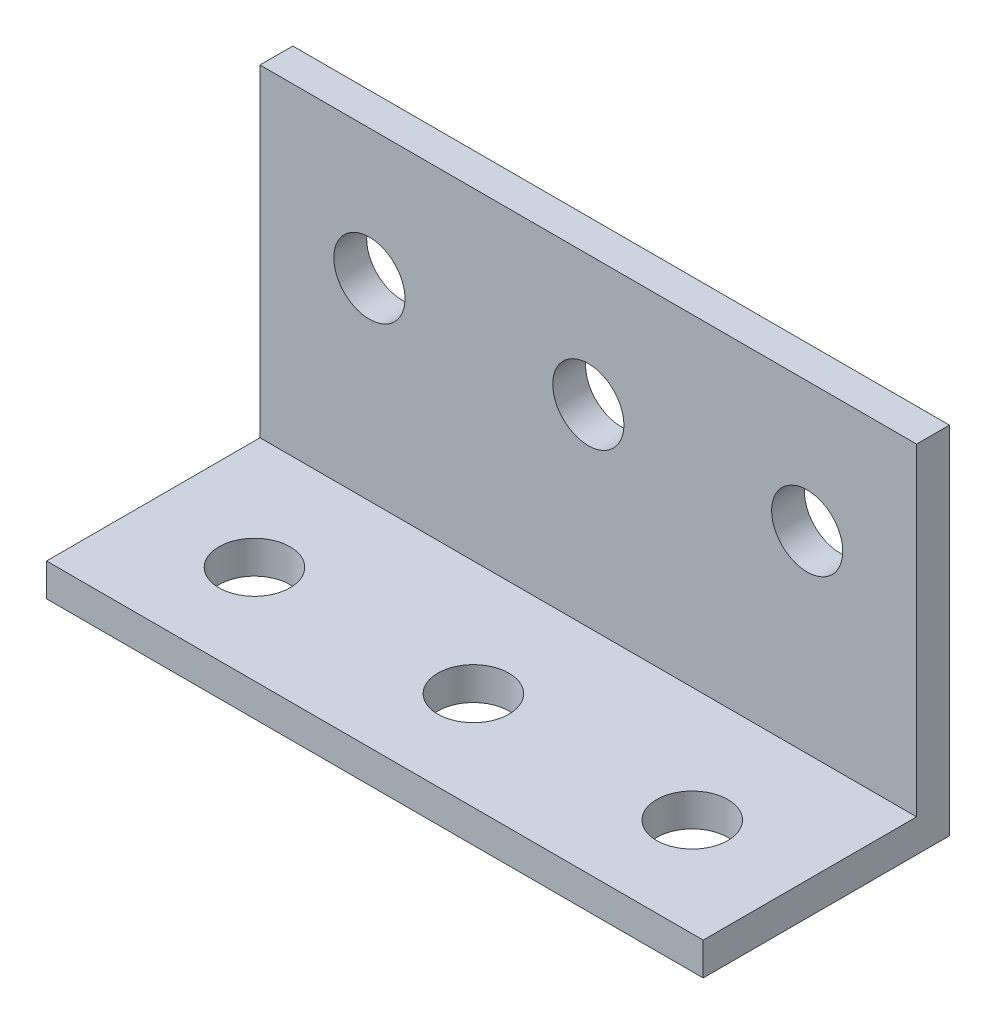
ISO-10303-21;
HEADER;
FILE_DESCRIPTION(('STEP AP214'),'2;1');
FILE_NAME('part.step','',(''),(''),'','','');
FILE_SCHEMA(('AUTOMOTIVE_DESIGN { 1 0 10303 214 1 1 1 1 }'));
ENDSEC;
DATA;
#1=APPLICATION_CONTEXT('core data for automotive mechanical design processes');
#2=APPLICATION_PROTOCOL_DEFINITION('international standard','automotive_design',2000,#1);
#3=PRODUCT_CONTEXT('',#1,'mechanical');
#4=PRODUCT('Part','Part','',(#3));
#5=PRODUCT_RELATED_PRODUCT_CATEGORY('part','',(#4));
#6=PRODUCT_DEFINITION_FORMATION('','',#4);
#7=PRODUCT_DEFINITION_CONTEXT('part definition',#1,'design');
#8=PRODUCT_DEFINITION('design','',#6,#7);
#9=PRODUCT_DEFINITION_SHAPE('','',#8);
#10=(LENGTH_UNIT() NAMED_UNIT(*) SI_UNIT(.MILLI.,.METRE.));
#11=(NAMED_UNIT(*) PLANE_ANGLE_UNIT() SI_UNIT($,.RADIAN.));
#12=(NAMED_UNIT(*) SI_UNIT($,.STERADIAN.) SOLID_ANGLE_UNIT());
#13=UNCERTAINTY_MEASURE_WITH_UNIT(LENGTH_MEASURE(1.E-05),#10,'distance_accuracy_value','');
#14=(GEOMETRIC_REPRESENTATION_CONTEXT(3) GLOBAL_UNCERTAINTY_ASSIGNED_CONTEXT((#13)) GLOBAL_UNIT_ASSIGNED_CONTEXT((#10,
#11,#12)) REPRESENTATION_CONTEXT('',''));
#15=CARTESIAN_POINT('',(0.,0.,0.));
#16=DIRECTION('',(0.,0.,1.));
#17=DIRECTION('',(1.,0.,0.));
#18=AXIS2_PLACEMENT_3D('',#15,#16,#17);
#19=CARTESIAN_POINT('',(0.,0.,90.));
#20=DIRECTION('',(1.,0.,0.));
#21=DIRECTION('',(0.,1.,0.));
#22=AXIS2_PLACEMENT_3D('',#19,#20,#21);
#23=PLANE('',#22);
#24=DIRECTION('',(0.,-1.,0.));
#25=VECTOR('',#24,1.);
#26=CARTESIAN_POINT('',(0.,0.,90.));
#27=LINE('',#26,#25);
#28=CARTESIAN_POINT('',(0.,12.,90.));
#29=VERTEX_POINT('',#28);
#30=CARTESIAN_POINT('',(0.,0.,90.));
#31=VERTEX_POINT('',#30);
#32=EDGE_CURVE('E99',#29,#31,#27,.T.);
#33=ORIENTED_EDGE('',*,*,#32,.F.);
#34=DIRECTION('',(0.,0.,1.));
#35=VECTOR('',#34,1.);
#36=CARTESIAN_POINT('',(0.,12.,90.));
#37=LINE('',#36,#35);
#38=CARTESIAN_POINT('',(0.,12.,12.));
#39=VERTEX_POINT('',#38);
#40=EDGE_CURVE('E49',#39,#29,#37,.T.);
#41=ORIENTED_EDGE('',*,*,#40,.F.);
#42=DIRECTION('',(0.,-1.,0.));
#43=VECTOR('',#42,1.);
#44=CARTESIAN_POINT('',(0.,130.,12.));
#45=LINE('',#44,#43);
#46=CARTESIAN_POINT('',(0.,130.,12.));
#47=VERTEX_POINT('',#46);
#48=EDGE_CURVE('E86',#47,#39,#45,.T.);
#49=ORIENTED_EDGE('',*,*,#48,.F.);
#50=DIRECTION('',(0.,0.,-1.));
#51=VECTOR('',#50,1.);
#52=CARTESIAN_POINT('',(0.,130.,90.));
#53=LINE('',#52,#51);
#54=CARTESIAN_POINT('',(0.,130.,0.));
#55=VERTEX_POINT('',#54);
#56=EDGE_CURVE('E78',#47,#55,#53,.T.);
#57=ORIENTED_EDGE('',*,*,#56,.T.);
#58=DIRECTION('',(0.,-1.,0.));
#59=VECTOR('',#58,1.);
#60=CARTESIAN_POINT('',(0.,0.,0.));
#61=LINE('',#60,#59);
#62=CARTESIAN_POINT('',(0.,0.,0.));
#63=VERTEX_POINT('',#62);
#64=EDGE_CURVE('E83',#55,#63,#61,.T.);
#65=ORIENTED_EDGE('',*,*,#64,.T.);
#66=DIRECTION('',(0.,0.,-1.));
#67=VECTOR('',#66,1.);
#68=CARTESIAN_POINT('',(0.,0.,90.));
#69=LINE('',#68,#67);
#70=EDGE_CURVE('E119',#31,#63,#69,.T.);
#71=ORIENTED_EDGE('',*,*,#70,.F.);
#72=EDGE_LOOP('',(#33,#41,#49,#57,#65,#71));
#73=FACE_BOUND('',#72,.T.);
#74=ADVANCED_FACE('F34',(#73),#23,.F.);
#75=CARTESIAN_POINT('',(0.,0.,90.));
#76=DIRECTION('',(0.,1.,0.));
#77=DIRECTION('',(0.,0.,1.));
#78=AXIS2_PLACEMENT_3D('',#75,#76,#77);
#79=PLANE('',#78);
#80=CARTESIAN_POINT('',(120.,0.,54.));
#81=DIRECTION('',(0.,-1.,0.));
#82=DIRECTION('',(0.,0.,-1.));
#83=AXIS2_PLACEMENT_3D('',#80,#81,#82);
#84=CIRCLE('',#83,13.);
#85=CARTESIAN_POINT('',(120.,0.,41.));
#86=VERTEX_POINT('',#85);
#87=EDGE_CURVE('E262',#86,#86,#84,.T.);
#88=ORIENTED_EDGE('',*,*,#87,.F.);
#89=EDGE_LOOP('',(#88));
#90=FACE_BOUND('',#89,.T.);
#91=CARTESIAN_POINT('',(40.,0.,54.));
#92=DIRECTION('',(0.,-1.,0.));
#93=DIRECTION('',(0.,0.,-1.));
#94=AXIS2_PLACEMENT_3D('',#91,#92,#93);
#95=CIRCLE('',#94,13.);
#96=CARTESIAN_POINT('',(40.,0.,41.));
#97=VERTEX_POINT('',#96);
#98=EDGE_CURVE('E134',#97,#97,#95,.T.);
#99=ORIENTED_EDGE('',*,*,#98,.F.);
#100=EDGE_LOOP('',(#99));
#101=FACE_BOUND('',#100,.T.);
#102=DIRECTION('',(1.,0.,0.));
#103=VECTOR('',#102,1.);
#104=CARTESIAN_POINT('',(0.,0.,0.));
#105=LINE('',#104,#103);
#106=CARTESIAN_POINT('',(240.,0.,0.));
#107=VERTEX_POINT('',#106);
#108=EDGE_CURVE('E104',#63,#107,#105,.T.);
#109=ORIENTED_EDGE('',*,*,#108,.T.);
#110=DIRECTION('',(0.,0.,-1.));
#111=VECTOR('',#110,1.);
#112=CARTESIAN_POINT('',(240.,0.,90.));
#113=LINE('',#112,#111);
#114=CARTESIAN_POINT('',(240.,0.,90.));
#115=VERTEX_POINT('',#114);
#116=EDGE_CURVE('E116',#115,#107,#113,.T.);
#117=ORIENTED_EDGE('',*,*,#116,.F.);
#118=DIRECTION('',(1.,0.,0.));
#119=VECTOR('',#118,1.);
#120=CARTESIAN_POINT('',(0.,0.,90.));
#121=LINE('',#120,#119);
#122=EDGE_CURVE('E58',#31,#115,#121,.T.);
#123=ORIENTED_EDGE('',*,*,#122,.F.);
#124=ORIENTED_EDGE('',*,*,#70,.T.);
#125=EDGE_LOOP('',(#109,#117,#123,#124));
#126=FACE_BOUND('',#125,.T.);
#127=CARTESIAN_POINT('',(200.,0.,54.));
#128=DIRECTION('',(0.,-1.,0.));
#129=DIRECTION('',(0.,0.,-1.));
#130=AXIS2_PLACEMENT_3D('',#127,#128,#129);
#131=CIRCLE('',#130,13.);
#132=CARTESIAN_POINT('',(200.,0.,41.));
#133=VERTEX_POINT('',#132);
#134=EDGE_CURVE('E42',#133,#133,#131,.T.);
#135=ORIENTED_EDGE('',*,*,#134,.F.);
#136=EDGE_LOOP('',(#135));
#137=FACE_BOUND('',#136,.T.);
#138=ADVANCED_FACE('F140',(#90,#101,#126,#137),#79,.F.);
#139=CARTESIAN_POINT('',(240.,0.,90.));
#140=DIRECTION('',(-1.,0.,0.));
#141=DIRECTION('',(0.,-1.,0.));
#142=AXIS2_PLACEMENT_3D('',#139,#140,#141);
#143=PLANE('',#142);
#144=DIRECTION('',(0.,-1.,0.));
#145=VECTOR('',#144,1.);
#146=CARTESIAN_POINT('',(240.,130.,12.));
#147=LINE('',#146,#145);
#148=CARTESIAN_POINT('',(240.,130.,12.));
#149=VERTEX_POINT('',#148);
#150=CARTESIAN_POINT('',(240.,12.0000000000001,12.));
#151=VERTEX_POINT('',#150);
#152=EDGE_CURVE('E277',#149,#151,#147,.T.);
#153=ORIENTED_EDGE('',*,*,#152,.T.);
#154=DIRECTION('',(0.,0.,1.));
#155=VECTOR('',#154,1.);
#156=CARTESIAN_POINT('',(240.,12.0000000000001,90.));
#157=LINE('',#156,#155);
#158=CARTESIAN_POINT('',(240.,12.0000000000001,90.));
#159=VERTEX_POINT('',#158);
#160=EDGE_CURVE('E280',#151,#159,#157,.T.);
#161=ORIENTED_EDGE('',*,*,#160,.T.);
#162=DIRECTION('',(0.,1.,0.));
#163=VECTOR('',#162,1.);
#164=CARTESIAN_POINT('',(240.,0.,90.));
#165=LINE('',#164,#163);
#166=EDGE_CURVE('E90',#115,#159,#165,.T.);
#167=ORIENTED_EDGE('',*,*,#166,.F.);
#168=ORIENTED_EDGE('',*,*,#116,.T.);
#169=DIRECTION('',(0.,1.,0.));
#170=VECTOR('',#169,1.);
#171=CARTESIAN_POINT('',(240.,0.,0.));
#172=LINE('',#171,#170);
#173=CARTESIAN_POINT('',(240.,130.,0.));
#174=VERTEX_POINT('',#173);
#175=EDGE_CURVE('E100',#107,#174,#172,.T.);
#176=ORIENTED_EDGE('',*,*,#175,.T.);
#177=DIRECTION('',(0.,0.,-1.));
#178=VECTOR('',#177,1.);
#179=CARTESIAN_POINT('',(240.,130.,90.));
#180=LINE('',#179,#178);
#181=EDGE_CURVE('E89',#149,#174,#180,.T.);
#182=ORIENTED_EDGE('',*,*,#181,.F.);
#183=EDGE_LOOP('',(#153,#161,#167,#168,#176,#182));
#184=FACE_BOUND('',#183,.T.);
#185=ADVANCED_FACE('F142',(#184),#143,.F.);
#186=CARTESIAN_POINT('',(0.,130.,90.));
#187=DIRECTION('',(0.,-1.,0.));
#188=DIRECTION('',(0.,0.,-1.));
#189=AXIS2_PLACEMENT_3D('',#186,#187,#188);
#190=PLANE('',#189);
#191=ORIENTED_EDGE('',*,*,#56,.F.);
#192=DIRECTION('',(-1.,0.,0.));
#193=VECTOR('',#192,1.);
#194=CARTESIAN_POINT('',(240.,130.,12.));
#195=LINE('',#194,#193);
#196=EDGE_CURVE('E283',#149,#47,#195,.T.);
#197=ORIENTED_EDGE('',*,*,#196,.F.);
#198=ORIENTED_EDGE('',*,*,#181,.T.);
#199=DIRECTION('',(-1.,0.,0.));
#200=VECTOR('',#199,1.);
#201=CARTESIAN_POINT('',(0.,130.,0.));
#202=LINE('',#201,#200);
#203=EDGE_CURVE('E93',#174,#55,#202,.T.);
#204=ORIENTED_EDGE('',*,*,#203,.T.);
#205=EDGE_LOOP('',(#191,#197,#198,#204));
#206=FACE_BOUND('',#205,.T.);
#207=ADVANCED_FACE('F94',(#206),#190,.F.);
#208=CARTESIAN_POINT('',(0.,0.,90.));
#209=DIRECTION('',(0.,0.,-1.));
#210=DIRECTION('',(-1.,0.,0.));
#211=AXIS2_PLACEMENT_3D('',#208,#209,#210);
#212=PLANE('',#211);
#213=ORIENTED_EDGE('',*,*,#166,.T.);
#214=DIRECTION('',(-1.,0.,0.));
#215=VECTOR('',#214,1.);
#216=CARTESIAN_POINT('',(240.,12.0000000000001,90.));
#217=LINE('',#216,#215);
#218=EDGE_CURVE('E106',#159,#29,#217,.T.);
#219=ORIENTED_EDGE('',*,*,#218,.T.);
#220=ORIENTED_EDGE('',*,*,#32,.T.);
#221=ORIENTED_EDGE('',*,*,#122,.T.);
#222=EDGE_LOOP('',(#213,#219,#220,#221));
#223=FACE_BOUND('',#222,.T.);
#224=ADVANCED_FACE('F190',(#223),#212,.F.);
#225=CARTESIAN_POINT('',(0.,0.,0.));
#226=DIRECTION('',(0.,0.,-1.));
#227=DIRECTION('',(-1.,0.,0.));
#228=AXIS2_PLACEMENT_3D('',#225,#226,#227);
#229=PLANE('',#228);
#230=CARTESIAN_POINT('',(120.,82.5,0.));
#231=DIRECTION('',(0.,0.,-1.));
#232=DIRECTION('',(-1.,0.,0.));
#233=AXIS2_PLACEMENT_3D('',#230,#231,#232);
#234=CIRCLE('',#233,13.);
#235=CARTESIAN_POINT('',(107.,82.5,0.));
#236=VERTEX_POINT('',#235);
#237=EDGE_CURVE('E133',#236,#236,#234,.T.);
#238=ORIENTED_EDGE('',*,*,#237,.F.);
#239=EDGE_LOOP('',(#238));
#240=FACE_BOUND('',#239,.T.);
#241=CARTESIAN_POINT('',(200.,82.5,0.));
#242=DIRECTION('',(0.,0.,-1.));
#243=DIRECTION('',(-1.,0.,0.));
#244=AXIS2_PLACEMENT_3D('',#241,#242,#243);
#245=CIRCLE('',#244,13.);
#246=CARTESIAN_POINT('',(187.,82.5,0.));
#247=VERTEX_POINT('',#246);
#248=EDGE_CURVE('E125',#247,#247,#245,.T.);
#249=ORIENTED_EDGE('',*,*,#248,.F.);
#250=EDGE_LOOP('',(#249));
#251=FACE_BOUND('',#250,.T.);
#252=ORIENTED_EDGE('',*,*,#64,.F.);
#253=ORIENTED_EDGE('',*,*,#203,.F.);
#254=ORIENTED_EDGE('',*,*,#175,.F.);
#255=ORIENTED_EDGE('',*,*,#108,.F.);
#256=EDGE_LOOP('',(#252,#253,#254,#255));
#257=FACE_BOUND('',#256,.T.);
#258=CARTESIAN_POINT('',(40.,82.5,0.));
#259=DIRECTION('',(0.,0.,-1.));
#260=DIRECTION('',(-1.,0.,0.));
#261=AXIS2_PLACEMENT_3D('',#258,#259,#260);
#262=CIRCLE('',#261,13.);
#263=CARTESIAN_POINT('',(27.,82.5,0.));
#264=VERTEX_POINT('',#263);
#265=EDGE_CURVE('E121',#264,#264,#262,.T.);
#266=ORIENTED_EDGE('',*,*,#265,.F.);
#267=EDGE_LOOP('',(#266));
#268=FACE_BOUND('',#267,.T.);
#269=ADVANCED_FACE('F102',(#240,#251,#257,#268),#229,.T.);
#270=CARTESIAN_POINT('',(240.,12.0000000000001,90.));
#271=DIRECTION('',(0.,-1.,0.));
#272=DIRECTION('',(1.,0.,0.));
#273=AXIS2_PLACEMENT_3D('',#270,#271,#272);
#274=PLANE('',#273);
#275=CARTESIAN_POINT('',(120.,12.,54.));
#276=DIRECTION('',(0.,-1.,0.));
#277=DIRECTION('',(1.,0.,0.));
#278=AXIS2_PLACEMENT_3D('',#275,#276,#277);
#279=CIRCLE('',#278,13.);
#280=CARTESIAN_POINT('',(133.,12.,54.));
#281=VERTEX_POINT('',#280);
#282=EDGE_CURVE('E265',#281,#281,#279,.T.);
#283=ORIENTED_EDGE('',*,*,#282,.T.);
#284=EDGE_LOOP('',(#283));
#285=FACE_BOUND('',#284,.T.);
#286=CARTESIAN_POINT('',(40.,12.,54.));
#287=DIRECTION('',(0.,-1.,0.));
#288=DIRECTION('',(1.,0.,0.));
#289=AXIS2_PLACEMENT_3D('',#286,#287,#288);
#290=CIRCLE('',#289,13.);
#291=CARTESIAN_POINT('',(53.,12.,54.));
#292=VERTEX_POINT('',#291);
#293=EDGE_CURVE('E131',#292,#292,#290,.T.);
#294=ORIENTED_EDGE('',*,*,#293,.T.);
#295=EDGE_LOOP('',(#294));
#296=FACE_BOUND('',#295,.T.);
#297=ORIENTED_EDGE('',*,*,#40,.T.);
#298=ORIENTED_EDGE('',*,*,#218,.F.);
#299=ORIENTED_EDGE('',*,*,#160,.F.);
#300=DIRECTION('',(-1.,0.,0.));
#301=VECTOR('',#300,1.);
#302=CARTESIAN_POINT('',(240.,12.0000000000001,12.));
#303=LINE('',#302,#301);
#304=EDGE_CURVE('E109',#151,#39,#303,.T.);
#305=ORIENTED_EDGE('',*,*,#304,.T.);
#306=EDGE_LOOP('',(#297,#298,#299,#305));
#307=FACE_BOUND('',#306,.T.);
#308=CARTESIAN_POINT('',(200.,12.,54.));
#309=DIRECTION('',(0.,-1.,0.));
#310=DIRECTION('',(1.,0.,0.));
#311=AXIS2_PLACEMENT_3D('',#308,#309,#310);
#312=CIRCLE('',#311,13.);
#313=CARTESIAN_POINT('',(213.,12.,54.));
#314=VERTEX_POINT('',#313);
#315=EDGE_CURVE('E11',#314,#314,#312,.T.);
#316=ORIENTED_EDGE('',*,*,#315,.T.);
#317=EDGE_LOOP('',(#316));
#318=FACE_BOUND('',#317,.T.);
#319=ADVANCED_FACE('F176',(#285,#296,#307,#318),#274,.F.);
#320=CARTESIAN_POINT('',(240.,130.,12.));
#321=DIRECTION('',(0.,0.,-1.));
#322=DIRECTION('',(0.,1.,0.));
#323=AXIS2_PLACEMENT_3D('',#320,#321,#322);
#324=PLANE('',#323);
#325=CARTESIAN_POINT('',(120.,82.5,12.));
#326=DIRECTION('',(0.,0.,-1.));
#327=DIRECTION('',(0.,1.,0.));
#328=AXIS2_PLACEMENT_3D('',#325,#326,#327);
#329=CIRCLE('',#328,13.);
#330=CARTESIAN_POINT('',(107.,82.5,12.));
#331=VERTEX_POINT('',#330);
#332=EDGE_CURVE('E273',#331,#331,#329,.T.);
#333=ORIENTED_EDGE('',*,*,#332,.T.);
#334=EDGE_LOOP('',(#333));
#335=FACE_BOUND('',#334,.T.);
#336=CARTESIAN_POINT('',(200.,82.5,12.));
#337=DIRECTION('',(0.,0.,-1.));
#338=DIRECTION('',(0.,1.,0.));
#339=AXIS2_PLACEMENT_3D('',#336,#337,#338);
#340=CIRCLE('',#339,13.);
#341=CARTESIAN_POINT('',(187.,82.5,12.));
#342=VERTEX_POINT('',#341);
#343=EDGE_CURVE('E122',#342,#342,#340,.T.);
#344=ORIENTED_EDGE('',*,*,#343,.T.);
#345=EDGE_LOOP('',(#344));
#346=FACE_BOUND('',#345,.T.);
#347=ORIENTED_EDGE('',*,*,#48,.T.);
#348=ORIENTED_EDGE('',*,*,#304,.F.);
#349=ORIENTED_EDGE('',*,*,#152,.F.);
#350=ORIENTED_EDGE('',*,*,#196,.T.);
#351=EDGE_LOOP('',(#347,#348,#349,#350));
#352=FACE_BOUND('',#351,.T.);
#353=CARTESIAN_POINT('',(40.,82.5,12.));
#354=DIRECTION('',(0.,0.,-1.));
#355=DIRECTION('',(0.,1.,0.));
#356=AXIS2_PLACEMENT_3D('',#353,#354,#355);
#357=CIRCLE('',#356,13.);
#358=CARTESIAN_POINT('',(27.,82.5,12.));
#359=VERTEX_POINT('',#358);
#360=EDGE_CURVE('E128',#359,#359,#357,.T.);
#361=ORIENTED_EDGE('',*,*,#360,.T.);
#362=EDGE_LOOP('',(#361));
#363=FACE_BOUND('',#362,.T.);
#364=ADVANCED_FACE('F174',(#335,#346,#352,#363),#324,.F.);
#365=CARTESIAN_POINT('',(200.,82.5,90.));
#366=DIRECTION('',(0.,0.,-1.));
#367=DIRECTION('',(-1.,0.,0.));
#368=AXIS2_PLACEMENT_3D('',#365,#366,#367);
#369=CYLINDRICAL_SURFACE('',#368,13.);
#370=CARTESIAN_POINT('',(187.,82.5,0.));
#371=CARTESIAN_POINT('',(187.,82.5,0.125));
#372=CARTESIAN_POINT('',(187.,82.5,0.25));
#373=CARTESIAN_POINT('',(187.,82.5,0.5));
#374=CARTESIAN_POINT('',(187.,82.5,0.625000000000001));
#375=CARTESIAN_POINT('',(187.,82.5,0.875000000000001));
#376=CARTESIAN_POINT('',(187.,82.5,1.));
#377=CARTESIAN_POINT('',(187.,82.5,1.25));
#378=CARTESIAN_POINT('',(187.,82.5,1.375));
#379=CARTESIAN_POINT('',(187.,82.5,1.625));
#380=CARTESIAN_POINT('',(187.,82.5,1.75));
#381=CARTESIAN_POINT('',(187.,82.5,2.));
#382=CARTESIAN_POINT('',(187.,82.5,2.125));
#383=CARTESIAN_POINT('',(187.,82.5,2.375));
#384=CARTESIAN_POINT('',(187.,82.5,2.5));
#385=CARTESIAN_POINT('',(187.,82.5,2.75));
#386=CARTESIAN_POINT('',(187.,82.5,2.875));
#387=CARTESIAN_POINT('',(187.,82.5,3.125));
#388=CARTESIAN_POINT('',(187.,82.5,3.24999999999999));
#389=CARTESIAN_POINT('',(187.,82.5,3.49999999999999));
#390=CARTESIAN_POINT('',(187.,82.5,3.62499999999999));
#391=CARTESIAN_POINT('',(187.,82.5,3.87499999999999));
#392=CARTESIAN_POINT('',(187.,82.5,3.99999999999999));
#393=CARTESIAN_POINT('',(187.,82.5,4.24999999999999));
#394=CARTESIAN_POINT('',(187.,82.5,4.37499999999999));
#395=CARTESIAN_POINT('',(187.,82.5,4.62499999999999));
#396=CARTESIAN_POINT('',(187.,82.5,4.74999999999999));
#397=CARTESIAN_POINT('',(187.,82.5,4.99999999999999));
#398=CARTESIAN_POINT('',(187.,82.5,5.12499999999999));
#399=CARTESIAN_POINT('',(187.,82.5,5.37499999999999));
#400=CARTESIAN_POINT('',(187.,82.5,5.49999999999999));
#401=CARTESIAN_POINT('',(187.,82.5,5.74999999999999));
#402=CARTESIAN_POINT('',(187.,82.5,5.87499999999999));
#403=CARTESIAN_POINT('',(187.,82.5,6.12499999999999));
#404=CARTESIAN_POINT('',(187.,82.5,6.24999999999999));
#405=CARTESIAN_POINT('',(187.,82.5,6.49999999999999));
#406=CARTESIAN_POINT('',(187.,82.5,6.62499999999999));
#407=CARTESIAN_POINT('',(187.,82.5,6.87499999999999));
#408=CARTESIAN_POINT('',(187.,82.5,6.99999999999999));
#409=CARTESIAN_POINT('',(187.,82.5,7.24999999999999));
#410=CARTESIAN_POINT('',(187.,82.5,7.37499999999999));
#411=CARTESIAN_POINT('',(187.,82.5,7.62499999999999));
#412=CARTESIAN_POINT('',(187.,82.5,7.74999999999999));
#413=CARTESIAN_POINT('',(187.,82.5,7.99999999999999));
#414=CARTESIAN_POINT('',(187.,82.5,8.12499999999999));
#415=CARTESIAN_POINT('',(187.,82.5,8.37499999999999));
#416=CARTESIAN_POINT('',(187.,82.5,8.49999999999999));
#417=CARTESIAN_POINT('',(187.,82.5,8.74999999999999));
#418=CARTESIAN_POINT('',(187.,82.5,8.87499999999999));
#419=CARTESIAN_POINT('',(187.,82.5,9.12499999999999));
#420=CARTESIAN_POINT('',(187.,82.5,9.24999999999999));
#421=CARTESIAN_POINT('',(187.,82.5,9.49999999999999));
#422=CARTESIAN_POINT('',(187.,82.5,9.62499999999999));
#423=CARTESIAN_POINT('',(187.,82.5,9.87499999999998));
#424=CARTESIAN_POINT('',(187.,82.5,9.99999999999998));
#425=CARTESIAN_POINT('',(187.,82.5,10.25));
#426=CARTESIAN_POINT('',(187.,82.5,10.375));
#427=CARTESIAN_POINT('',(187.,82.5,10.625));
#428=CARTESIAN_POINT('',(187.,82.5,10.75));
#429=CARTESIAN_POINT('',(187.,82.5,11.));
#430=CARTESIAN_POINT('',(187.,82.5,11.125));
#431=CARTESIAN_POINT('',(187.,82.5,11.375));
#432=CARTESIAN_POINT('',(187.,82.5,11.5));
#433=CARTESIAN_POINT('',(187.,82.5,11.75));
#434=CARTESIAN_POINT('',(187.,82.5,11.875));
#435=CARTESIAN_POINT('',(187.,82.5,12.));
#436=B_SPLINE_CURVE_WITH_KNOTS('',3,(#370,#371,#372,#373,#374,#375,#376,#377,#378,#379,#380,
#381,#382,#383,#384,#385,#386,#387,#388,#389,#390,#391,#392,#393,#394,#395,#396,#397,#398,#399,
#400,#401,#402,#403,#404,#405,#406,#407,#408,#409,#410,#411,#412,#413,#414,#415,#416,#417,#418,
#419,#420,#421,#422,#423,#424,#425,#426,#427,#428,#429,#430,#431,#432,#433,#434,#435),
.UNSPECIFIED.,.F.,.F.,(4,2,2,2,2,2,2,2,2,2,2,2,2,2,2,2,2,2,2,2,2,2,2,2,2,2,2,2,2,2,2,2,4),(0.,
0.375,0.750000000000001,1.125,1.5,1.875,2.25,2.625,3.,3.37499999999999,3.74999999999999,
4.12499999999999,4.49999999999999,4.87499999999999,5.24999999999999,5.62499999999999,
5.99999999999999,6.37499999999999,6.74999999999999,7.12499999999999,7.49999999999999,
7.87499999999999,8.24999999999999,8.62499999999999,8.99999999999998,9.37499999999999,
9.74999999999998,10.125,10.5,10.875,11.25,11.625,12.),.UNSPECIFIED.);
#437=EDGE_CURVE('BSEAM167',#247,#342,#436,.T.);
#438=ORIENTED_EDGE('',*,*,#248,.T.);
#439=ORIENTED_EDGE('',*,*,#343,.F.);
#440=ORIENTED_EDGE('',*,*,#437,.T.);
#441=ORIENTED_EDGE('',*,*,#437,.F.);
#442=EDGE_LOOP('',(#438,#440,#439,#441));
#443=FACE_BOUND('',#442,.T.);
#444=ADVANCED_FACE('F167',(#443),#369,.F.);
#445=CARTESIAN_POINT('',(120.,82.5,90.));
#446=DIRECTION('',(0.,0.,-1.));
#447=DIRECTION('',(-1.,0.,0.));
#448=AXIS2_PLACEMENT_3D('',#445,#446,#447);
#449=CYLINDRICAL_SURFACE('',#448,13.);
#450=CARTESIAN_POINT('',(107.,82.5,0.));
#451=CARTESIAN_POINT('',(107.,82.5,0.125));
#452=CARTESIAN_POINT('',(107.,82.5,0.25));
#453=CARTESIAN_POINT('',(107.,82.5,0.5));
#454=CARTESIAN_POINT('',(107.,82.5,0.625000000000001));
#455=CARTESIAN_POINT('',(107.,82.5,0.875000000000001));
#456=CARTESIAN_POINT('',(107.,82.5,1.));
#457=CARTESIAN_POINT('',(107.,82.5,1.25));
#458=CARTESIAN_POINT('',(107.,82.5,1.375));
#459=CARTESIAN_POINT('',(107.,82.5,1.625));
#460=CARTESIAN_POINT('',(107.,82.5,1.75));
#461=CARTESIAN_POINT('',(107.,82.5,2.));
#462=CARTESIAN_POINT('',(107.,82.5,2.125));
#463=CARTESIAN_POINT('',(107.,82.5,2.375));
#464=CARTESIAN_POINT('',(107.,82.5,2.5));
#465=CARTESIAN_POINT('',(107.,82.5,2.75));
#466=CARTESIAN_POINT('',(107.,82.5,2.875));
#467=CARTESIAN_POINT('',(107.,82.5,3.125));
#468=CARTESIAN_POINT('',(107.,82.5,3.24999999999999));
#469=CARTESIAN_POINT('',(107.,82.5,3.49999999999999));
#470=CARTESIAN_POINT('',(107.,82.5,3.62499999999999));
#471=CARTESIAN_POINT('',(107.,82.5,3.87499999999999));
#472=CARTESIAN_POINT('',(107.,82.5,3.99999999999999));
#473=CARTESIAN_POINT('',(107.,82.5,4.24999999999999));
#474=CARTESIAN_POINT('',(107.,82.5,4.37499999999999));
#475=CARTESIAN_POINT('',(107.,82.5,4.62499999999999));
#476=CARTESIAN_POINT('',(107.,82.5,4.74999999999999));
#477=CARTESIAN_POINT('',(107.,82.5,4.99999999999999));
#478=CARTESIAN_POINT('',(107.,82.5,5.12499999999999));
#479=CARTESIAN_POINT('',(107.,82.5,5.37499999999999));
#480=CARTESIAN_POINT('',(107.,82.5,5.49999999999999));
#481=CARTESIAN_POINT('',(107.,82.5,5.74999999999999));
#482=CARTESIAN_POINT('',(107.,82.5,5.87499999999999));
#483=CARTESIAN_POINT('',(107.,82.5,6.12499999999999));
#484=CARTESIAN_POINT('',(107.,82.5,6.24999999999999));
#485=CARTESIAN_POINT('',(107.,82.5,6.49999999999999));
#486=CARTESIAN_POINT('',(107.,82.5,6.62499999999999));
#487=CARTESIAN_POINT('',(107.,82.5,6.87499999999999));
#488=CARTESIAN_POINT('',(107.,82.5,6.99999999999999));
#489=CARTESIAN_POINT('',(107.,82.5,7.24999999999999));
#490=CARTESIAN_POINT('',(107.,82.5,7.37499999999999));
#491=CARTESIAN_POINT('',(107.,82.5,7.62499999999999));
#492=CARTESIAN_POINT('',(107.,82.5,7.74999999999999));
#493=CARTESIAN_POINT('',(107.,82.5,7.99999999999999));
#494=CARTESIAN_POINT('',(107.,82.5,8.12499999999999));
#495=CARTESIAN_POINT('',(107.,82.5,8.37499999999999));
#496=CARTESIAN_POINT('',(107.,82.5,8.49999999999999));
#497=CARTESIAN_POINT('',(107.,82.5,8.74999999999999));
#498=CARTESIAN_POINT('',(107.,82.5,8.87499999999999));
#499=CARTESIAN_POINT('',(107.,82.5,9.12499999999999));
#500=CARTESIAN_POINT('',(107.,82.5,9.24999999999999));
#501=CARTESIAN_POINT('',(107.,82.5,9.49999999999999));
#502=CARTESIAN_POINT('',(107.,82.5,9.62499999999999));
#503=CARTESIAN_POINT('',(107.,82.5,9.87499999999998));
#504=CARTESIAN_POINT('',(107.,82.5,9.99999999999998));
#505=CARTESIAN_POINT('',(107.,82.5,10.25));
#506=CARTESIAN_POINT('',(107.,82.5,10.375));
#507=CARTESIAN_POINT('',(107.,82.5,10.625));
#508=CARTESIAN_POINT('',(107.,82.5,10.75));
#509=CARTESIAN_POINT('',(107.,82.5,11.));
#510=CARTESIAN_POINT('',(107.,82.5,11.125));
#511=CARTESIAN_POINT('',(107.,82.5,11.375));
#512=CARTESIAN_POINT('',(107.,82.5,11.5));
#513=CARTESIAN_POINT('',(107.,82.5,11.75));
#514=CARTESIAN_POINT('',(107.,82.5,11.875));
#515=CARTESIAN_POINT('',(107.,82.5,12.));
#516=B_SPLINE_CURVE_WITH_KNOTS('',3,(#450,#451,#452,#453,#454,#455,#456,#457,#458,#459,#460,
#461,#462,#463,#464,#465,#466,#467,#468,#469,#470,#471,#472,#473,#474,#475,#476,#477,#478,#479,
#480,#481,#482,#483,#484,#485,#486,#487,#488,#489,#490,#491,#492,#493,#494,#495,#496,#497,#498,
#499,#500,#501,#502,#503,#504,#505,#506,#507,#508,#509,#510,#511,#512,#513,#514,#515),
.UNSPECIFIED.,.F.,.F.,(4,2,2,2,2,2,2,2,2,2,2,2,2,2,2,2,2,2,2,2,2,2,2,2,2,2,2,2,2,2,2,2,4),(0.,
0.375,0.750000000000001,1.125,1.5,1.875,2.25,2.625,3.,3.37499999999999,3.74999999999999,
4.12499999999999,4.49999999999999,4.87499999999999,5.24999999999999,5.62499999999999,
5.99999999999999,6.37499999999999,6.74999999999999,7.12499999999999,7.49999999999999,
7.87499999999999,8.24999999999999,8.62499999999999,8.99999999999998,9.37499999999999,
9.74999999999998,10.125,10.5,10.875,11.25,11.625,12.),.UNSPECIFIED.);
#517=EDGE_CURVE('BSEAM158',#236,#331,#516,.T.);
#518=ORIENTED_EDGE('',*,*,#237,.T.);
#519=ORIENTED_EDGE('',*,*,#332,.F.);
#520=ORIENTED_EDGE('',*,*,#517,.T.);
#521=ORIENTED_EDGE('',*,*,#517,.F.);
#522=EDGE_LOOP('',(#518,#520,#519,#521));
#523=FACE_BOUND('',#522,.T.);
#524=ADVANCED_FACE('F158',(#523),#449,.F.);
#525=CARTESIAN_POINT('',(40.,82.5,90.));
#526=DIRECTION('',(0.,0.,-1.));
#527=DIRECTION('',(-1.,0.,0.));
#528=AXIS2_PLACEMENT_3D('',#525,#526,#527);
#529=CYLINDRICAL_SURFACE('',#528,13.);
#530=CARTESIAN_POINT('',(27.,82.5,0.));
#531=CARTESIAN_POINT('',(27.,82.5,0.125));
#532=CARTESIAN_POINT('',(27.,82.5,0.25));
#533=CARTESIAN_POINT('',(27.,82.5,0.5));
#534=CARTESIAN_POINT('',(27.,82.5,0.625000000000001));
#535=CARTESIAN_POINT('',(27.,82.5,0.875000000000001));
#536=CARTESIAN_POINT('',(27.,82.5,1.));
#537=CARTESIAN_POINT('',(27.,82.5,1.25));
#538=CARTESIAN_POINT('',(27.,82.5,1.375));
#539=CARTESIAN_POINT('',(27.,82.5,1.625));
#540=CARTESIAN_POINT('',(27.,82.5,1.75));
#541=CARTESIAN_POINT('',(27.,82.5,2.));
#542=CARTESIAN_POINT('',(27.,82.5,2.125));
#543=CARTESIAN_POINT('',(27.,82.5,2.375));
#544=CARTESIAN_POINT('',(27.,82.5,2.5));
#545=CARTESIAN_POINT('',(27.,82.5,2.75));
#546=CARTESIAN_POINT('',(27.,82.5,2.875));
#547=CARTESIAN_POINT('',(27.,82.5,3.125));
#548=CARTESIAN_POINT('',(27.,82.5,3.24999999999999));
#549=CARTESIAN_POINT('',(27.,82.5,3.49999999999999));
#550=CARTESIAN_POINT('',(27.,82.5,3.62499999999999));
#551=CARTESIAN_POINT('',(27.,82.5,3.87499999999999));
#552=CARTESIAN_POINT('',(27.,82.5,3.99999999999999));
#553=CARTESIAN_POINT('',(27.,82.5,4.24999999999999));
#554=CARTESIAN_POINT('',(27.,82.5,4.37499999999999));
#555=CARTESIAN_POINT('',(27.,82.5,4.62499999999999));
#556=CARTESIAN_POINT('',(27.,82.5,4.74999999999999));
#557=CARTESIAN_POINT('',(27.,82.5,4.99999999999999));
#558=CARTESIAN_POINT('',(27.,82.5,5.12499999999999));
#559=CARTESIAN_POINT('',(27.,82.5,5.37499999999999));
#560=CARTESIAN_POINT('',(27.,82.5,5.49999999999999));
#561=CARTESIAN_POINT('',(27.,82.5,5.74999999999999));
#562=CARTESIAN_POINT('',(27.,82.5,5.87499999999999));
#563=CARTESIAN_POINT('',(27.,82.5,6.12499999999999));
#564=CARTESIAN_POINT('',(27.,82.5,6.24999999999999));
#565=CARTESIAN_POINT('',(27.,82.5,6.49999999999999));
#566=CARTESIAN_POINT('',(27.,82.5,6.62499999999999));
#567=CARTESIAN_POINT('',(27.,82.5,6.87499999999999));
#568=CARTESIAN_POINT('',(27.,82.5,6.99999999999999));
#569=CARTESIAN_POINT('',(27.,82.5,7.24999999999999));
#570=CARTESIAN_POINT('',(27.,82.5,7.37499999999999));
#571=CARTESIAN_POINT('',(27.,82.5,7.62499999999999));
#572=CARTESIAN_POINT('',(27.,82.5,7.74999999999999));
#573=CARTESIAN_POINT('',(27.,82.5,7.99999999999999));
#574=CARTESIAN_POINT('',(27.,82.5,8.12499999999999));
#575=CARTESIAN_POINT('',(27.,82.5,8.37499999999999));
#576=CARTESIAN_POINT('',(27.,82.5,8.49999999999999));
#577=CARTESIAN_POINT('',(27.,82.5,8.74999999999999));
#578=CARTESIAN_POINT('',(27.,82.5,8.87499999999999));
#579=CARTESIAN_POINT('',(27.,82.5,9.12499999999999));
#580=CARTESIAN_POINT('',(27.,82.5,9.24999999999999));
#581=CARTESIAN_POINT('',(27.,82.5,9.49999999999999));
#582=CARTESIAN_POINT('',(27.,82.5,9.62499999999999));
#583=CARTESIAN_POINT('',(27.,82.5,9.87499999999998));
#584=CARTESIAN_POINT('',(27.,82.5,9.99999999999998));
#585=CARTESIAN_POINT('',(27.,82.5,10.25));
#586=CARTESIAN_POINT('',(27.,82.5,10.375));
#587=CARTESIAN_POINT('',(27.,82.5,10.625));
#588=CARTESIAN_POINT('',(27.,82.5,10.75));
#589=CARTESIAN_POINT('',(27.,82.5,11.));
#590=CARTESIAN_POINT('',(27.,82.5,11.125));
#591=CARTESIAN_POINT('',(27.,82.5,11.375));
#592=CARTESIAN_POINT('',(27.,82.5,11.5));
#593=CARTESIAN_POINT('',(27.,82.5,11.75));
#594=CARTESIAN_POINT('',(27.,82.5,11.875));
#595=CARTESIAN_POINT('',(27.,82.5,12.));
#596=B_SPLINE_CURVE_WITH_KNOTS('',3,(#530,#531,#532,#533,#534,#535,#536,#537,#538,#539,#540,
#541,#542,#543,#544,#545,#546,#547,#548,#549,#550,#551,#552,#553,#554,#555,#556,#557,#558,#559,
#560,#561,#562,#563,#564,#565,#566,#567,#568,#569,#570,#571,#572,#573,#574,#575,#576,#577,#578,
#579,#580,#581,#582,#583,#584,#585,#586,#587,#588,#589,#590,#591,#592,#593,#594,#595),
.UNSPECIFIED.,.F.,.F.,(4,2,2,2,2,2,2,2,2,2,2,2,2,2,2,2,2,2,2,2,2,2,2,2,2,2,2,2,2,2,2,2,4),(0.,
0.375,0.750000000000001,1.125,1.5,1.875,2.25,2.625,3.,3.37499999999999,3.74999999999999,
4.12499999999999,4.49999999999999,4.87499999999999,5.24999999999999,5.62499999999999,
5.99999999999999,6.37499999999999,6.74999999999999,7.12499999999999,7.49999999999999,
7.87499999999999,8.24999999999999,8.62499999999999,8.99999999999998,9.37499999999999,
9.74999999999998,10.125,10.5,10.875,11.25,11.625,12.),.UNSPECIFIED.);
#597=EDGE_CURVE('BSEAM155',#264,#359,#596,.T.);
#598=ORIENTED_EDGE('',*,*,#265,.T.);
#599=ORIENTED_EDGE('',*,*,#360,.F.);
#600=ORIENTED_EDGE('',*,*,#597,.T.);
#601=ORIENTED_EDGE('',*,*,#597,.F.);
#602=EDGE_LOOP('',(#598,#600,#599,#601));
#603=FACE_BOUND('',#602,.T.);
#604=ADVANCED_FACE('F155',(#603),#529,.F.);
#605=CARTESIAN_POINT('',(40.,130.,54.));
#606=DIRECTION('',(0.,-1.,0.));
#607=DIRECTION('',(0.,0.,-1.));
#608=AXIS2_PLACEMENT_3D('',#605,#606,#607);
#609=CYLINDRICAL_SURFACE('',#608,13.);
#610=ORIENTED_EDGE('',*,*,#98,.T.);
#611=EDGE_LOOP('',(#610));
#612=FACE_BOUND('',#611,.T.);
#613=ORIENTED_EDGE('',*,*,#293,.F.);
#614=EDGE_LOOP('',(#613));
#615=FACE_BOUND('',#614,.T.);
#616=ADVANCED_FACE('F157',(#612,#615),#609,.F.);
#617=CARTESIAN_POINT('',(120.,130.,54.));
#618=DIRECTION('',(0.,-1.,0.));
#619=DIRECTION('',(0.,0.,-1.));
#620=AXIS2_PLACEMENT_3D('',#617,#618,#619);
#621=CYLINDRICAL_SURFACE('',#620,13.);
#622=ORIENTED_EDGE('',*,*,#87,.T.);
#623=EDGE_LOOP('',(#622));
#624=FACE_BOUND('',#623,.T.);
#625=ORIENTED_EDGE('',*,*,#282,.F.);
#626=EDGE_LOOP('',(#625));
#627=FACE_BOUND('',#626,.T.);
#628=ADVANCED_FACE('F164',(#624,#627),#621,.F.);
#629=CARTESIAN_POINT('',(200.,130.,54.));
#630=DIRECTION('',(0.,-1.,0.));
#631=DIRECTION('',(0.,0.,-1.));
#632=AXIS2_PLACEMENT_3D('',#629,#630,#631);
#633=CYLINDRICAL_SURFACE('',#632,13.);
#634=ORIENTED_EDGE('',*,*,#134,.T.);
#635=EDGE_LOOP('',(#634));
#636=FACE_BOUND('',#635,.T.);
#637=ORIENTED_EDGE('',*,*,#315,.F.);
#638=EDGE_LOOP('',(#637));
#639=FACE_BOUND('',#638,.T.);
#640=ADVANCED_FACE('F36',(#636,#639),#633,.F.);
#641=CLOSED_SHELL('',(#74,#138,#185,#207,#224,#269,#319,#364,#444,#524,#604,#616,#628,#640));
#642=MANIFOLD_SOLID_BREP('B2',#641);
#643=ADVANCED_BREP_SHAPE_REPRESENTATION('',(#18,#642),#14);
#644=SHAPE_DEFINITION_REPRESENTATION(#9,#643);
ENDSEC;
END-ISO-10303-21;
